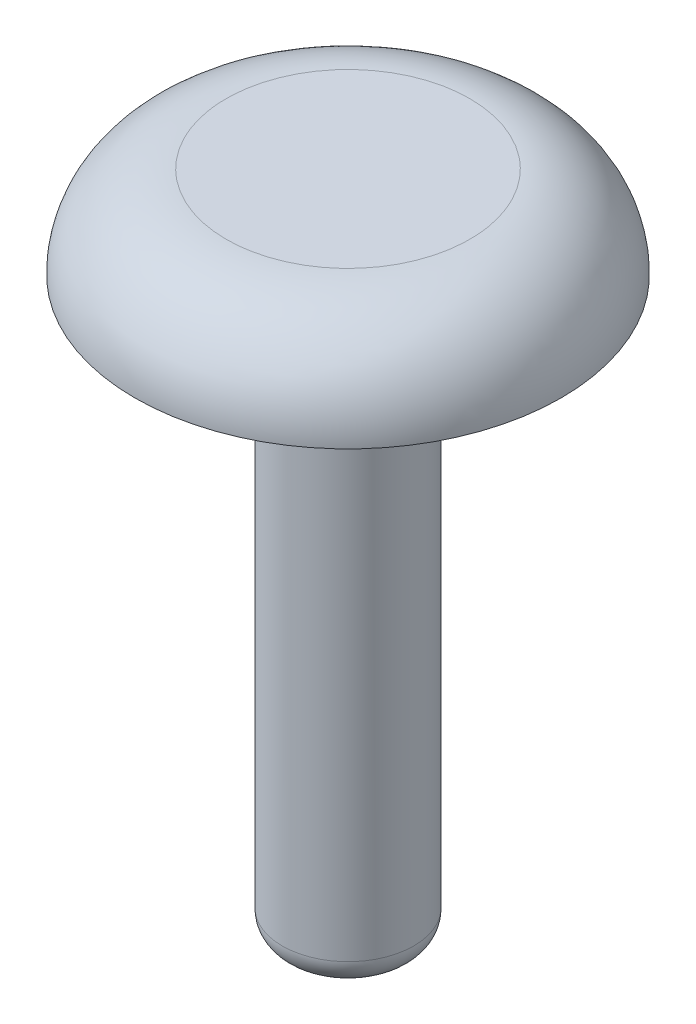
ISO-10303-21;
HEADER;
FILE_DESCRIPTION(('STEP AP214'),'2;1');
FILE_NAME('part.step','',(''),(''),'','','');
FILE_SCHEMA(('AUTOMOTIVE_DESIGN { 1 0 10303 214 1 1 1 1 }'));
ENDSEC;
DATA;
#1=APPLICATION_CONTEXT('core data for automotive mechanical design processes');
#2=APPLICATION_PROTOCOL_DEFINITION('international standard','automotive_design',2000,#1);
#3=PRODUCT_CONTEXT('',#1,'mechanical');
#4=PRODUCT('Part','Part','',(#3));
#5=PRODUCT_RELATED_PRODUCT_CATEGORY('part','',(#4));
#6=PRODUCT_DEFINITION_FORMATION('','',#4);
#7=PRODUCT_DEFINITION_CONTEXT('part definition',#1,'design');
#8=PRODUCT_DEFINITION('design','',#6,#7);
#9=PRODUCT_DEFINITION_SHAPE('','',#8);
#10=(LENGTH_UNIT() NAMED_UNIT(*) SI_UNIT(.MILLI.,.METRE.));
#11=(NAMED_UNIT(*) PLANE_ANGLE_UNIT() SI_UNIT($,.RADIAN.));
#12=(NAMED_UNIT(*) SI_UNIT($,.STERADIAN.) SOLID_ANGLE_UNIT());
#13=UNCERTAINTY_MEASURE_WITH_UNIT(LENGTH_MEASURE(1.E-05),#10,'distance_accuracy_value','');
#14=(GEOMETRIC_REPRESENTATION_CONTEXT(3) GLOBAL_UNCERTAINTY_ASSIGNED_CONTEXT((#13)) GLOBAL_UNIT_ASSIGNED_CONTEXT((#10,
#11,#12)) REPRESENTATION_CONTEXT('',''));
#15=CARTESIAN_POINT('',(0.,0.,0.));
#16=DIRECTION('',(0.,0.,1.));
#17=DIRECTION('',(1.,0.,0.));
#18=AXIS2_PLACEMENT_3D('',#15,#16,#17);
#19=CARTESIAN_POINT('',(-1.12895331786144,1.70000000000003,0.));
#20=DIRECTION('',(0.,1.,0.));
#21=DIRECTION('',(0.,0.,1.));
#22=AXIS2_PLACEMENT_3D('',#19,#20,#21);
#23=PLANE('',#22);
#24=CARTESIAN_POINT('',(0.,1.70000000000003,2.25790663572288));
#25=CARTESIAN_POINT('',(-0.0345944417074065,1.70000000000003,2.25790723830574));
#26=CARTESIAN_POINT('',(-0.0691888354077026,1.70000000000003,2.25711160204306));
#27=CARTESIAN_POINT('',(-0.138304572993575,1.70000000000003,2.25393217828492));
#28=CARTESIAN_POINT('',(-0.172825916879151,1.70000000000003,2.25154839078945));
#29=CARTESIAN_POINT('',(-0.241722601035083,1.70000000000003,2.24519699102403));
#30=CARTESIAN_POINT('',(-0.276097941305438,1.70000000000003,2.24122937875407));
#31=CARTESIAN_POINT('',(-0.344630014186162,1.70000000000003,2.23171890038318));
#32=CARTESIAN_POINT('',(-0.378786746796529,1.70000000000003,2.22617603428224));
#33=CARTESIAN_POINT('',(-0.446809451015982,1.70000000000003,2.21352670584837));
#34=CARTESIAN_POINT('',(-0.480675422625067,1.70000000000003,2.20642024351544));
#35=CARTESIAN_POINT('',(-0.548045068635516,1.70000000000003,2.1906587475224));
#36=CARTESIAN_POINT('',(-0.581548743036879,1.70000000000003,2.18200371386229));
#37=CARTESIAN_POINT('',(-0.648123023014524,1.70000000000003,2.16316335431147));
#38=CARTESIAN_POINT('',(-0.681193628590805,1.70000000000003,2.15297802842076));
#39=CARTESIAN_POINT('',(-0.746831913987679,1.70000000000003,2.13109859931469));
#40=CARTESIAN_POINT('',(-0.779399593808271,1.70000000000003,2.11940449609933));
#41=CARTESIAN_POINT('',(-0.843963234254863,1.70000000000003,2.09453221807052));
#42=CARTESIAN_POINT('',(-0.875959194880862,1.70000000000004,2.08135404325706));
#43=CARTESIAN_POINT('',(-0.939311806733374,1.70000000000002,2.05354144432956));
#44=CARTESIAN_POINT('',(-0.970668457959886,1.69999999999998,2.03890702021551));
#45=CARTESIAN_POINT('',(-1.03267622786847,1.70000000000008,2.00821289057648));
#46=CARTESIAN_POINT('',(-1.06332734655055,1.70000000000022,1.9921531850515));
#47=CARTESIAN_POINT('',(-1.12385925653853,1.69999999999984,1.95864221155326));
#48=CARTESIAN_POINT('',(-1.15374004784444,1.69999999999933,1.94119094358));
#49=CARTESIAN_POINT('',(-1.21266836691226,1.70000000000073,1.90493447261932));
#50=CARTESIAN_POINT('',(-1.24171589467418,1.70000000000264,1.88612926963189));
#51=CARTESIAN_POINT('',(-1.29891564680158,1.69999999999742,1.84720179967126));
#52=CARTESIAN_POINT('',(-1.32706787116706,1.69999999999028,1.82707953269805));
#53=CARTESIAN_POINT('',(-1.37356412712841,1.70000000000666,1.79221214318223));
#54=CARTESIAN_POINT('',(-1.39216410852251,1.70000000002111,1.77780674866815));
#55=CARTESIAN_POINT('',(-1.42891192834887,1.69999999987319,1.74842936572794));
#56=CARTESIAN_POINT('',(-1.4470597617613,1.69999999971083,1.73345737101595));
#57=CARTESIAN_POINT('',(-1.48288469436497,1.69999999859713,1.70295959238686));
#58=CARTESIAN_POINT('',(-1.50056178267736,1.69999999764578,1.68743379569083));
#59=CARTESIAN_POINT('',(-1.53542885431097,1.69999999378802,1.65584380966571));
#60=CARTESIAN_POINT('',(-1.55261882052197,1.69999999088156,1.639779601468));
#61=CARTESIAN_POINT('',(-1.59496431370679,1.69999997983591,1.59896316851181));
#62=CARTESIAN_POINT('',(-1.61980496783891,1.69999996980696,1.57388311680096));
#63=CARTESIAN_POINT('',(-1.66830559466222,1.69999993341846,1.52260015393194));
#64=CARTESIAN_POINT('',(-1.69196545190144,1.69999990705733,1.49639713343964));
#65=CARTESIAN_POINT('',(-1.7226665131159,1.69999986171165,1.46075091782226));
#66=CARTESIAN_POINT('',(-1.73026695081503,1.69999984953357,1.45178562150157));
#67=CARTESIAN_POINT('',(-1.74532073395057,1.69999982771945,1.43373178678576));
#68=CARTESIAN_POINT('',(-1.75277407496623,1.69999981808348,1.4246432447005));
#69=CARTESIAN_POINT('',(-1.77491273572648,1.69999979298965,1.39719842732472));
#70=CARTESIAN_POINT('',(-1.78937676720597,1.69999978134574,1.37866287498459));
#71=CARTESIAN_POINT('',(-1.81769709736541,1.69999977212144,1.34113344415272));
#72=CARTESIAN_POINT('',(-1.8315533907647,1.69999977454117,1.32213956168075));
#73=CARTESIAN_POINT('',(-1.85864421125324,1.69999979261982,1.28371400600913));
#74=CARTESIAN_POINT('',(-1.87187875420654,1.69999980827841,1.26428234399822));
#75=CARTESIAN_POINT('',(-1.8977105890352,1.69999984841979,1.22500175042022));
#76=CARTESIAN_POINT('',(-1.91030791893674,1.69999987290205,1.20515284385281));
#77=CARTESIAN_POINT('',(-1.93485564325837,1.69999992254533,1.16506130777584));
#78=CARTESIAN_POINT('',(-1.94680609835838,1.69999994770628,1.14481871543884));
#79=CARTESIAN_POINT('',(-1.97003301856126,1.69999998625968,1.10395412939772));
#80=CARTESIAN_POINT('',(-1.98130956987114,1.69999999965363,1.08333218466435));
#81=CARTESIAN_POINT('',(-2.00437941501385,1.70000000038271,1.03957945311998));
#82=CARTESIAN_POINT('',(-2.01610315560318,1.69999998484199,1.0164120909842));
#83=CARTESIAN_POINT('',(-2.03883863097991,1.69999996528629,0.969732320627679));
#84=CARTESIAN_POINT('',(-2.04985042419616,1.69999996127035,0.946219940917003));
#85=CARTESIAN_POINT('',(-2.06844478535254,1.69999997111093,0.904771009221577));
#86=CARTESIAN_POINT('',(-2.07619648717312,1.69999998075083,0.886909831661434));
#87=CARTESIAN_POINT('',(-2.09134451360013,1.69999999410436,0.851033139700912));
#88=CARTESIAN_POINT('',(-2.09874080449656,1.69999999781743,0.833017610850829));
#89=CARTESIAN_POINT('',(-2.11002125176066,1.69999999956469,0.804027635713947));
#90=CARTESIAN_POINT('',(-2.11412104549851,1.69999999928282,0.793137022373607));
#91=CARTESIAN_POINT('',(-2.13012985035399,1.699999998692,0.749655098008602));
#92=CARTESIAN_POINT('',(-2.14141337742254,1.69999999943645,0.716829864176932));
#93=CARTESIAN_POINT('',(-2.15807607588678,1.69999999988675,0.664376498001134));
#94=CARTESIAN_POINT('',(-2.16396615686088,1.69999999989492,0.644909017817556));
#95=CARTESIAN_POINT('',(-2.1762415216558,1.69999999994391,0.602277101358538));
#96=CARTESIAN_POINT('',(-2.18252278063238,1.69999999999037,0.579082706919839));
#97=CARTESIAN_POINT('',(-2.19829773004697,1.70000000001616,0.516914261978212));
#98=CARTESIAN_POINT('',(-2.20712781371227,1.69999999992973,0.477768867557914));
#99=CARTESIAN_POINT('',(-2.21880246610589,1.69999999982049,0.418746475235502));
#100=CARTESIAN_POINT('',(-2.22243238862839,1.69999999978748,0.39902080838883));
#101=CARTESIAN_POINT('',(-2.22916641319575,1.6999999997322,0.359479434733386));
#102=CARTESIAN_POINT('',(-2.23227051640762,1.69999999970993,0.339663728124549));
#103=CARTESIAN_POINT('',(-2.23889728324894,1.69999999968029,0.293338976238643));
#104=CARTESIAN_POINT('',(-2.24221461902071,1.69999999968037,0.266800356553573));
#105=CARTESIAN_POINT('',(-2.2479062323769,1.69999999971408,0.213622381180891));
#106=CARTESIAN_POINT('',(-2.25028050884502,1.69999999974771,0.186983025374075));
#107=CARTESIAN_POINT('',(-2.25408299574836,1.69999999983178,0.133636776981282));
#108=CARTESIAN_POINT('',(-2.25551120282397,1.69999999988222,0.10692988415581));
#109=CARTESIAN_POINT('',(-2.25742004442182,1.69999999996643,0.0534819036626336));
#110=CARTESIAN_POINT('',(-2.2579006733358,1.70000000000021,0.0267408157934825));
#111=CARTESIAN_POINT('',(-2.25791134298486,1.69999999999989,-0.0211116829197574));
#112=CARTESIAN_POINT('',(-2.25762019109285,1.69999999997859,-0.0422231962550326));
#113=CARTESIAN_POINT('',(-2.25644562155866,1.69999999989757,-0.0844294050410459));
#114=CARTESIAN_POINT('',(-2.2555622001887,1.69999999983785,-0.105524100385094));
#115=CARTESIAN_POINT('',(-2.25202456385614,1.69999999960782,-0.168758316043121));
#116=CARTESIAN_POINT('',(-2.24848297740581,1.69999999938666,-0.210851747332528));
#117=CARTESIAN_POINT('',(-2.2390445808654,1.69999999884144,-0.294771650993341));
#118=CARTESIAN_POINT('',(-2.23314774442228,1.69999999851739,-0.336598120372372));
#119=CARTESIAN_POINT('',(-2.21901733398925,1.69999999779655,-0.419855591003171));
#120=CARTESIAN_POINT('',(-2.21078373603247,1.69999999739977,-0.461286588194296));
#121=CARTESIAN_POINT('',(-2.19200569202143,1.69999999656097,-0.543621771710986));
#122=CARTESIAN_POINT('',(-2.1814612244209,1.69999999611897,-0.584525953120816));
#123=CARTESIAN_POINT('',(-2.15809460207404,1.69999999521464,-0.665678912052985));
#124=CARTESIAN_POINT('',(-2.14527242821463,1.69999999475232,-0.705927684072444));
#125=CARTESIAN_POINT('',(-2.11739073489288,1.69999999382965,-0.785643001313076));
#126=CARTESIAN_POINT('',(-2.10233119874224,1.69999999336929,-0.825109540697153));
#127=CARTESIAN_POINT('',(-2.07002217228772,1.69999999247021,-0.903136110902495));
#128=CARTESIAN_POINT('',(-2.05277266769102,1.69999999203148,-0.941696135805449));
#129=CARTESIAN_POINT('',(-2.01613799736041,1.69999999119269,-1.01778822887133));
#130=CARTESIAN_POINT('',(-1.99675281967933,1.69999999079262,-1.05532029128226));
#131=CARTESIAN_POINT('',(-1.95590782641789,1.69999999004557,-1.12923825437605));
#132=CARTESIAN_POINT('',(-1.93444800116607,1.69999998969859,-1.16562414971474));
#133=CARTESIAN_POINT('',(-1.88952127397328,1.69999998906949,-1.23713518245326));
#134=CARTESIAN_POINT('',(-1.86605436454712,1.69999998878738,-1.27226031515052));
#135=CARTESIAN_POINT('',(-1.81718735522223,1.69999998829721,-1.34113919843341));
#136=CARTESIAN_POINT('',(-1.79178724991627,1.69999998808915,-1.37489294518278));
#137=CARTESIAN_POINT('',(-1.7391338271569,1.69999998775363,-1.44092275274251));
#138=CARTESIAN_POINT('',(-1.71188050624778,1.69999998762618,-1.4731988107972));
#139=CARTESIAN_POINT('',(-1.65560647059065,1.6999999874558,-1.53617159281601));
#140=CARTESIAN_POINT('',(-1.62658575419478,1.69999998741287,-1.56686831530756));
#141=CARTESIAN_POINT('',(-1.56686831530764,1.69999998741287,-1.62658575419486));
#142=CARTESIAN_POINT('',(-1.53617159281638,1.6999999874558,-1.65560647059062));
#143=CARTESIAN_POINT('',(-1.47319881079683,1.69999998762618,-1.71188050624781));
#144=CARTESIAN_POINT('',(-1.44092275274112,1.69999998775363,-1.73913382715709));
#145=CARTESIAN_POINT('',(-1.37489294518417,1.69999998808915,-1.79178724991608));
#146=CARTESIAN_POINT('',(-1.34113919843858,1.69999998829721,-1.8171873552215));
#147=CARTESIAN_POINT('',(-1.27226031514535,1.69999998878738,-1.86605436454785));
#148=CARTESIAN_POINT('',(-1.23713518243394,1.69999998906949,-1.88952127397602));
#149=CARTESIAN_POINT('',(-1.16562414973406,1.69999998969859,-1.93444800116333));
#150=CARTESIAN_POINT('',(-1.12923825444815,1.69999999004557,-1.95590782640766));
#151=CARTESIAN_POINT('',(-1.05532029121016,1.69999999079262,-1.99675281968956));
#152=CARTESIAN_POINT('',(-1.01778822860226,1.69999999119269,-2.01613799739859));
#153=CARTESIAN_POINT('',(-0.941696136074519,1.69999999203148,-2.05277266765284));
#154=CARTESIAN_POINT('',(-0.903136111906671,1.69999999247021,-2.07002217214524));
#155=CARTESIAN_POINT('',(-0.825109539692984,1.69999999336929,-2.10233119888473));
#156=CARTESIAN_POINT('',(-0.785642997565477,1.69999999382965,-2.11739073542462));
#157=CARTESIAN_POINT('',(-0.705927687820015,1.69999999475232,-2.14527242768289));
#158=CARTESIAN_POINT('',(-0.66567892603906,1.69999999521464,-2.15809460008957));
#159=CARTESIAN_POINT('',(-0.584525939134859,1.69999999611897,-2.18146122640535));
#160=CARTESIAN_POINT('',(-0.543621719514901,1.69999999656097,-2.19200569942748));
#161=CARTESIAN_POINT('',(-0.461286640389895,1.69999999739977,-2.2107837286265));
#162=CARTESIAN_POINT('',(-0.419855785798895,1.69999999779656,-2.21901730634991));
#163=CARTESIAN_POINT('',(-0.336597925578646,1.69999999851738,-2.23314777206135));
#164=CARTESIAN_POINT('',(-0.294770924016962,1.69999999884141,-2.23904468401526));
#165=CARTESIAN_POINT('',(-0.210852474300774,1.69999999938669,-2.2484828742571));
#166=CARTESIAN_POINT('',(-0.168761029110466,1.69999999960795,-2.25202417890205));
#167=CARTESIAN_POINT('',(-0.0844463400292574,1.69999999991439,-2.2567416280398));
#168=CARTESIAN_POINT('',(-0.0422230977421811,1.69999999999956,-2.25791780120212));
#169=CARTESIAN_POINT('',(0.,1.70000000000003,-2.25790663572288));
#170=B_SPLINE_CURVE_WITH_KNOTS('',3,(#24,#25,#26,#27,#28,#29,#30,#31,#32,#33,#34,#35,#36,#37,
#38,#39,#40,#41,#42,#43,#44,#45,#46,#47,#48,#49,#50,#51,#52,#53,#54,#55,#56,#57,#58,#59,#60,#61,
#62,#63,#64,#65,#66,#67,#68,#69,#70,#71,#72,#73,#74,#75,#76,#77,#78,#79,#80,#81,#82,#83,#84,#85,
#86,#87,#88,#89,#90,#91,#92,#93,#94,#95,#96,#97,#98,#99,#100,#101,#102,#103,#104,#105,#106,#107,
#108,#109,#110,#111,#112,#113,#114,#115,#116,#117,#118,#119,#120,#121,#122,#123,#124,#125,#126,
#127,#128,#129,#130,#131,#132,#133,#134,#135,#136,#137,#138,#139,#140,#141,#142,#143,#144,#145,
#146,#147,#148,#149,#150,#151,#152,#153,#154,#155,#156,#157,#158,#159,#160,#161,#162,#163,#164,
#165,#166,#167,#168,#169),.UNSPECIFIED.,.F.,.F.,(4,2,2,2,2,2,2,2,2,2,2,2,2,2,2,2,2,2,2,2,2,2,2,
2,2,2,2,2,2,2,2,2,2,2,2,2,2,2,2,2,2,2,2,2,2,2,2,2,2,2,2,2,2,2,2,2,2,2,2,2,2,2,2,2,2,2,2,2,2,2,2,
2,4),(0.,0.103774108735635,0.20754821747127,0.311322326206906,0.415096434942541,
0.518870543678177,0.622644652413812,0.726418761149447,0.830192869885082,0.933966978620717,
1.03774108735635,1.14151519609199,1.24528930482762,1.34906341356326,1.45283752229889,
1.52340538125457,1.59397402331897,1.66454429480118,1.73511704200661,1.84097739965858,
1.94684808757074,1.98210729348658,2.01736755745018,2.08788774529313,2.15840854576941,
2.22892754591983,2.29944233281878,2.36995049359324,2.44044961544188,2.51833158566066,
2.59620715604674,2.65461625815248,2.71303088935048,2.74793957972149,2.8520291673365,
2.91303952859306,2.98511850235941,3.1054388059104,3.16560391745347,3.22576889546386,
3.30598695776809,3.38620511502668,3.46642355714838,3.54664247404191,3.609974735507,
3.67330739559286,3.79996138776333,3.92661679711289,4.0532735055433,4.17993139495631,
4.30659034725366,4.43325024433709,4.55991096810835,4.68657240046918,4.81323442332131,
4.9398969185665,5.06655976810646,5.19322285384296,5.31988605767771,5.44654926151246,
5.57321234724895,5.69987519678892,5.8265376920341,5.95319971488624,6.07986114724707,
6.20652187101832,6.33318176810176,6.45984072039911,6.58649860981211,6.71315531824253,
6.83981072759209,6.96646471976256,7.09311717665567),.UNSPECIFIED.);
#171=CARTESIAN_POINT('',(-1.81737783836882E-06,1.70000000000003,2.25790663572142));
#172=VERTEX_POINT('',#171);
#173=CARTESIAN_POINT('',(-1.8173696872263E-06,1.70000000000003,-2.25790663614445));
#174=VERTEX_POINT('',#173);
#175=EDGE_CURVE('E33',#172,#174,#170,.T.);
#176=ORIENTED_EDGE('',*,*,#175,.F.);
#177=CARTESIAN_POINT('',(0.,1.70000000000003,-2.25790663572288));
#178=CARTESIAN_POINT('',(0.0345944417074063,1.70000000000003,-2.25790723830574));
#179=CARTESIAN_POINT('',(0.0691888354077022,1.70000000000003,-2.25711160204306));
#180=CARTESIAN_POINT('',(0.138304572993574,1.70000000000003,-2.25393217828492));
#181=CARTESIAN_POINT('',(0.172825916879151,1.70000000000003,-2.25154839078945));
#182=CARTESIAN_POINT('',(0.241722601035083,1.70000000000003,-2.24519699102403));
#183=CARTESIAN_POINT('',(0.276097941305439,1.70000000000003,-2.24122937875407));
#184=CARTESIAN_POINT('',(0.344630014186162,1.70000000000003,-2.23171890038318));
#185=CARTESIAN_POINT('',(0.378786746796529,1.70000000000003,-2.22617603428224));
#186=CARTESIAN_POINT('',(0.446809451015981,1.70000000000003,-2.21352670584837));
#187=CARTESIAN_POINT('',(0.480675422625066,1.70000000000003,-2.20642024351544));
#188=CARTESIAN_POINT('',(0.548045068635515,1.70000000000003,-2.1906587475224));
#189=CARTESIAN_POINT('',(0.58154874303688,1.70000000000003,-2.18200371386229));
#190=CARTESIAN_POINT('',(0.648123023014525,1.70000000000003,-2.16316335431147));
#191=CARTESIAN_POINT('',(0.681193628590806,1.70000000000003,-2.15297802842076));
#192=CARTESIAN_POINT('',(0.746831913987679,1.70000000000003,-2.13109859931469));
#193=CARTESIAN_POINT('',(0.779399593808271,1.70000000000003,-2.11940449609933));
#194=CARTESIAN_POINT('',(0.843963234254863,1.70000000000003,-2.09453221807052));
#195=CARTESIAN_POINT('',(0.875959194880863,1.70000000000004,-2.08135404325706));
#196=CARTESIAN_POINT('',(0.939311806733375,1.70000000000002,-2.05354144432956));
#197=CARTESIAN_POINT('',(0.970668457959887,1.69999999999998,-2.03890702021551));
#198=CARTESIAN_POINT('',(1.03267622786847,1.70000000000008,-2.00821289057648));
#199=CARTESIAN_POINT('',(1.06332734655055,1.70000000000022,-1.9921531850515));
#200=CARTESIAN_POINT('',(1.12385925653853,1.69999999999984,-1.95864221155326));
#201=CARTESIAN_POINT('',(1.15374004784444,1.69999999999933,-1.94119094358));
#202=CARTESIAN_POINT('',(1.21266836691226,1.70000000000073,-1.90493447261932));
#203=CARTESIAN_POINT('',(1.24171589467419,1.70000000000264,-1.88612926963189));
#204=CARTESIAN_POINT('',(1.29891564680158,1.69999999999742,-1.84720179967126));
#205=CARTESIAN_POINT('',(1.32706787116706,1.69999999999028,-1.82707953269805));
#206=CARTESIAN_POINT('',(1.37356412712841,1.70000000000666,-1.79221214318223));
#207=CARTESIAN_POINT('',(1.39216410852252,1.70000000002111,-1.77780674866814));
#208=CARTESIAN_POINT('',(1.42891192834888,1.69999999987319,-1.74842936572793));
#209=CARTESIAN_POINT('',(1.44705976176131,1.69999999971083,-1.73345737101594));
#210=CARTESIAN_POINT('',(1.48288469436498,1.69999999859713,-1.70295959238685));
#211=CARTESIAN_POINT('',(1.50056178267738,1.69999999764578,-1.68743379569082));
#212=CARTESIAN_POINT('',(1.53542885431099,1.69999999378802,-1.65584380966569));
#213=CARTESIAN_POINT('',(1.55261882052199,1.69999999088156,-1.63977960146798));
#214=CARTESIAN_POINT('',(1.59496431370681,1.69999997983591,-1.59896316851179));
#215=CARTESIAN_POINT('',(1.61980496783894,1.69999996980696,-1.57388311680094));
#216=CARTESIAN_POINT('',(1.66830559466226,1.69999993341846,-1.52260015393191));
#217=CARTESIAN_POINT('',(1.69196545190148,1.69999990705733,-1.49639713343961));
#218=CARTESIAN_POINT('',(1.72266651311593,1.69999986171165,-1.46075091782223));
#219=CARTESIAN_POINT('',(1.73026695081507,1.69999984953357,-1.45178562150154));
#220=CARTESIAN_POINT('',(1.74532073395061,1.69999982771945,-1.43373178678573));
#221=CARTESIAN_POINT('',(1.75277407496627,1.69999981808348,-1.42464324470048));
#222=CARTESIAN_POINT('',(1.77491273572652,1.69999979298965,-1.3971984273247));
#223=CARTESIAN_POINT('',(1.789376767206,1.69999978134574,-1.37866287498457));
#224=CARTESIAN_POINT('',(1.81769709736544,1.69999977212144,-1.3411334441527));
#225=CARTESIAN_POINT('',(1.83155339076473,1.69999977454117,-1.32213956168073));
#226=CARTESIAN_POINT('',(1.85864421125326,1.69999979261982,-1.28371400600911));
#227=CARTESIAN_POINT('',(1.87187875420656,1.69999980827841,-1.26428234399821));
#228=CARTESIAN_POINT('',(1.89771058903522,1.69999984841979,-1.22500175042021));
#229=CARTESIAN_POINT('',(1.91030791893676,1.69999987290205,-1.2051528438528));
#230=CARTESIAN_POINT('',(1.93485564325838,1.69999992254533,-1.16506130777583));
#231=CARTESIAN_POINT('',(1.94680609835839,1.69999994770628,-1.14481871543883));
#232=CARTESIAN_POINT('',(1.97003301856126,1.69999998625968,-1.10395412939772));
#233=CARTESIAN_POINT('',(1.98130956987114,1.69999999965363,-1.08333218466435));
#234=CARTESIAN_POINT('',(2.00437941501385,1.70000000038271,-1.03957945311996));
#235=CARTESIAN_POINT('',(2.01610315560318,1.69999998484199,-1.01641209098418));
#236=CARTESIAN_POINT('',(2.03883863097994,1.69999996528629,-0.969732320627634));
#237=CARTESIAN_POINT('',(2.04985042419621,1.69999996127035,-0.946219940916954));
#238=CARTESIAN_POINT('',(2.06844478535255,1.69999997111093,-0.904771009221491));
#239=CARTESIAN_POINT('',(2.07619648717309,1.69999998075083,-0.886909831661324));
#240=CARTESIAN_POINT('',(2.09134451360023,1.69999999410436,-0.851033139700832));
#241=CARTESIAN_POINT('',(2.09874080449684,1.69999999781743,-0.833017610850804));
#242=CARTESIAN_POINT('',(2.11002125175077,1.69999999956469,-0.804027635738964));
#243=CARTESIAN_POINT('',(2.11412104547911,1.69999999928282,-0.793137022423925));
#244=CARTESIAN_POINT('',(2.13012985032732,1.699999998692,-0.749655098081878));
#245=CARTESIAN_POINT('',(2.14141337739825,1.69999999943645,-0.716829864247879));
#246=CARTESIAN_POINT('',(2.1580760758682,1.69999999988675,-0.664376498060704));
#247=CARTESIAN_POINT('',(2.1639661568456,1.69999999989492,-0.644909017868097));
#248=CARTESIAN_POINT('',(2.17624152164809,1.69999999994391,-0.602277101386288));
#249=CARTESIAN_POINT('',(2.18252278062875,1.69999999999037,-0.579082706933773));
#250=CARTESIAN_POINT('',(2.19829773004712,1.70000000001616,-0.516914261978244));
#251=CARTESIAN_POINT('',(2.20712781371254,1.69999999992973,-0.477768867557969));
#252=CARTESIAN_POINT('',(2.2188024661063,1.69999999982049,-0.418746475235577));
#253=CARTESIAN_POINT('',(2.22243238862883,1.69999999978748,-0.399020808388909));
#254=CARTESIAN_POINT('',(2.22916641319625,1.6999999997322,-0.359479434733466));
#255=CARTESIAN_POINT('',(2.23227051640814,1.69999999970993,-0.339663728124626));
#256=CARTESIAN_POINT('',(2.23889728324948,1.69999999968029,-0.293338976238713));
#257=CARTESIAN_POINT('',(2.24221461902125,1.69999999968037,-0.266800356553636));
#258=CARTESIAN_POINT('',(2.24790623237742,1.69999999971408,-0.213622381180939));
#259=CARTESIAN_POINT('',(2.2502805088455,1.69999999974771,-0.186983025374115));
#260=CARTESIAN_POINT('',(2.25408299574876,1.69999999983178,-0.133636776981305));
#261=CARTESIAN_POINT('',(2.25551120282431,1.69999999988222,-0.106929884155826));
#262=CARTESIAN_POINT('',(2.25742004442201,1.69999999996643,-0.0534819036626385));
#263=CARTESIAN_POINT('',(2.2579006733359,1.70000000000021,-0.0267408157934838));
#264=CARTESIAN_POINT('',(2.25791134298479,1.69999999999989,0.0211116829197568));
#265=CARTESIAN_POINT('',(2.25762019109269,1.69999999997859,0.04222319625503));
#266=CARTESIAN_POINT('',(2.25644562155834,1.69999999989757,0.0844294050410341));
#267=CARTESIAN_POINT('',(2.2555622001883,1.69999999983785,0.105524100385075));
#268=CARTESIAN_POINT('',(2.25202456385552,1.69999999960782,0.168758316043073));
#269=CARTESIAN_POINT('',(2.24848297740504,1.69999999938666,0.210851747332455));
#270=CARTESIAN_POINT('',(2.23904458086435,1.69999999884144,0.294771650993202));
#271=CARTESIAN_POINT('',(2.23314774442111,1.69999999851739,0.336598120372194));
#272=CARTESIAN_POINT('',(2.21901733398784,1.69999999779655,0.419855591002902));
#273=CARTESIAN_POINT('',(2.21078373603094,1.69999999739977,0.461286588193976));
#274=CARTESIAN_POINT('',(2.19200569201969,1.69999999656097,0.543621771710552));
#275=CARTESIAN_POINT('',(2.18146122441905,1.69999999611897,0.58452595312032));
#276=CARTESIAN_POINT('',(2.15809460207201,1.69999999521464,0.665678912052359));
#277=CARTESIAN_POINT('',(2.14527242821252,1.69999999475232,0.705927684071749));
#278=CARTESIAN_POINT('',(2.11739073489062,1.69999999382965,0.785643001312239));
#279=CARTESIAN_POINT('',(2.10233119873992,1.69999999336929,0.825109540696242));
#280=CARTESIAN_POINT('',(2.07002217228529,1.69999999247021,0.903136110901432));
#281=CARTESIAN_POINT('',(2.05277266768853,1.69999999203148,0.941696135804309));
#282=CARTESIAN_POINT('',(2.01613799735785,1.69999999119269,1.01778822887003));
#283=CARTESIAN_POINT('',(1.99675281967673,1.69999999079262,1.05532029128088));
#284=CARTESIAN_POINT('',(1.95590782641525,1.69999999004557,1.12923825437453));
#285=CARTESIAN_POINT('',(1.93444800116341,1.69999998969859,1.16562414971314));
#286=CARTESIAN_POINT('',(1.8895212739706,1.69999998906949,1.23713518245151));
#287=CARTESIAN_POINT('',(1.86605436454444,1.69999998878738,1.2722603151487));
#288=CARTESIAN_POINT('',(1.81718735521957,1.69999998829721,1.34113919843144));
#289=CARTESIAN_POINT('',(1.79178724991362,1.69999998808915,1.37489294518075));
#290=CARTESIAN_POINT('',(1.73913382715429,1.69999998775363,1.44092275274034));
#291=CARTESIAN_POINT('',(1.7118805062452,1.69999998762618,1.47319881079498));
#292=CARTESIAN_POINT('',(1.65560647058813,1.6999999874558,1.53617159281368));
#293=CARTESIAN_POINT('',(1.6265857541923,1.69999998741287,1.56686831530517));
#294=CARTESIAN_POINT('',(1.56686831530526,1.69999998741287,1.62658575419239));
#295=CARTESIAN_POINT('',(1.53617159281404,1.6999999874558,1.65560647058811));
#296=CARTESIAN_POINT('',(1.47319881079461,1.69999998762618,1.71188050624522));
#297=CARTESIAN_POINT('',(1.44092275273896,1.69999998775363,1.73913382715448));
#298=CARTESIAN_POINT('',(1.37489294518213,1.69999998808915,1.79178724991343));
#299=CARTESIAN_POINT('',(1.34113919843662,1.69999998829721,1.81718735521884));
#300=CARTESIAN_POINT('',(1.27226031514352,1.69999998878738,1.86605436454517));
#301=CARTESIAN_POINT('',(1.23713518243219,1.69999998906949,1.88952127397334));
#302=CARTESIAN_POINT('',(1.16562414973245,1.69999998969859,1.93444800116066));
#303=CARTESIAN_POINT('',(1.12923825444662,1.69999999004557,1.95590782640502));
#304=CARTESIAN_POINT('',(1.05532029120879,1.69999999079262,1.99675281968696));
#305=CARTESIAN_POINT('',(1.01778822860096,1.69999999119269,2.01613799739602));
#306=CARTESIAN_POINT('',(0.941696136073377,1.69999999203148,2.05277266765035));
#307=CARTESIAN_POINT('',(0.903136111905607,1.69999999247021,2.07002217214281));
#308=CARTESIAN_POINT('',(0.825109539692072,1.69999999336929,2.1023311988824));
#309=CARTESIAN_POINT('',(0.785642997564639,1.69999999382965,2.11739073542237));
#310=CARTESIAN_POINT('',(0.70592768781932,1.69999999475232,2.14527242768078));
#311=CARTESIAN_POINT('',(0.665678926038433,1.69999999521464,2.15809460008754));
#312=CARTESIAN_POINT('',(0.584525939134362,1.69999999611897,2.1814612264035));
#313=CARTESIAN_POINT('',(0.543621719514466,1.69999999656097,2.19200569942573));
#314=CARTESIAN_POINT('',(0.461286640389573,1.69999999739977,2.21078372862497));
#315=CARTESIAN_POINT('',(0.419855785798625,1.69999999779656,2.21901730634849));
#316=CARTESIAN_POINT('',(0.336597925578468,1.69999999851738,2.23314777206018));
#317=CARTESIAN_POINT('',(0.294770924016823,1.69999999884141,2.23904468401422));
#318=CARTESIAN_POINT('',(0.2108524743007,1.69999999938669,2.24848287425633));
#319=CARTESIAN_POINT('',(0.168761029110419,1.69999999960795,2.25202417890143));
#320=CARTESIAN_POINT('',(0.0844463400292442,1.69999999991439,2.25674162803948));
#321=CARTESIAN_POINT('',(0.0422230977421765,1.69999999999956,2.25791780120196));
#322=CARTESIAN_POINT('',(0.,1.70000000000003,2.25790663572288));
#323=B_SPLINE_CURVE_WITH_KNOTS('',3,(#177,#178,#179,#180,#181,#182,#183,#184,#185,#186,#187,
#188,#189,#190,#191,#192,#193,#194,#195,#196,#197,#198,#199,#200,#201,#202,#203,#204,#205,#206,
#207,#208,#209,#210,#211,#212,#213,#214,#215,#216,#217,#218,#219,#220,#221,#222,#223,#224,#225,
#226,#227,#228,#229,#230,#231,#232,#233,#234,#235,#236,#237,#238,#239,#240,#241,#242,#243,#244,
#245,#246,#247,#248,#249,#250,#251,#252,#253,#254,#255,#256,#257,#258,#259,#260,#261,#262,#263,
#264,#265,#266,#267,#268,#269,#270,#271,#272,#273,#274,#275,#276,#277,#278,#279,#280,#281,#282,
#283,#284,#285,#286,#287,#288,#289,#290,#291,#292,#293,#294,#295,#296,#297,#298,#299,#300,#301,
#302,#303,#304,#305,#306,#307,#308,#309,#310,#311,#312,#313,#314,#315,#316,#317,#318,#319,#320,
#321,#322),.UNSPECIFIED.,.F.,.F.,(4,2,2,2,2,2,2,2,2,2,2,2,2,2,2,2,2,2,2,2,2,2,2,2,2,2,2,2,2,2,2,
2,2,2,2,2,2,2,2,2,2,2,2,2,2,2,2,2,2,2,2,2,2,2,2,2,2,2,2,2,2,2,2,2,2,2,2,2,2,2,2,2,4),(0.,
0.103774108735634,0.20754821747127,0.311322326206906,0.415096434942541,0.518870543678175,
0.622644652413813,0.726418761149447,0.830192869885081,0.933966978620719,1.03774108735635,
1.14151519609199,1.24528930482762,1.34906341356326,1.45283752229889,1.52340538125458,
1.59397402331898,1.6645442948012,1.73511704200663,1.84097739965862,1.94684808757079,
1.98210729348663,2.01736755745022,2.08788774529317,2.15840854576944,2.22892754591985,
2.2994423328188,2.36995049359325,2.44044961544189,2.5183315856607,2.59620715604682,
2.65461625815258,2.71303088935062,2.74793957964054,2.85202916726448,2.91303952854983,
2.98511850235937,3.10543880591036,3.16560391745345,3.22576889546386,3.3059869577681,
3.38620511502671,3.46642355714842,3.54664247404196,3.60997473550704,3.6733073955929,
3.79996138776332,3.92661679711282,4.05327350554315,4.17993139495606,4.30659034725328,
4.43325024433658,4.55991096810769,4.68657240046835,4.81323442332031,4.93989691856531,
5.06655976810509,5.1932228538414,5.31988605767596,5.44654926151052,5.57321234724682,
5.6998751967866,5.8265376920316,5.95319971488356,6.07986114724423,6.20652187101534,
6.33318176809863,6.45984072039586,6.58649860980877,6.71315531823909,6.83981072758859,
6.96646471975902,7.09311717665212),.UNSPECIFIED.);
#324=EDGE_CURVE('E38',#174,#172,#323,.T.);
#325=ORIENTED_EDGE('',*,*,#324,.F.);
#326=EDGE_LOOP('',(#176,#325));
#327=FACE_BOUND('',#326,.T.);
#328=ADVANCED_FACE('F17',(#327),#23,.T.);
#329=CARTESIAN_POINT('',(0.,0.00788824899100593,0.));
#330=DIRECTION('',(0.,1.,0.));
#331=DIRECTION('',(0.,0.,1.));
#332=AXIS2_PLACEMENT_3D('',#329,#330,#331);
#333=TOROIDAL_SURFACE('',#332,2.25790663575208,1.69211175097982);
#334=ORIENTED_EDGE('',*,*,#175,.T.);
#335=ORIENTED_EDGE('',*,*,#324,.T.);
#336=EDGE_LOOP('',(#334,#335));
#337=FACE_BOUND('',#336,.T.);
#338=CARTESIAN_POINT('',(0.,0.,0.));
#339=DIRECTION('',(0.,1.,0.));
#340=DIRECTION('',(0.,0.,1.));
#341=AXIS2_PLACEMENT_3D('',#338,#339,#340);
#342=CIRCLE('',#341,3.95000000000001);
#343=CARTESIAN_POINT('',(0.,0.,3.95000000000001));
#344=VERTEX_POINT('',#343);
#345=EDGE_CURVE('E21',#344,#344,#342,.F.);
#346=ORIENTED_EDGE('',*,*,#345,.F.);
#347=EDGE_LOOP('',(#346));
#348=FACE_BOUND('',#347,.T.);
#349=ADVANCED_FACE('F36',(#337,#348),#333,.T.);
#350=CARTESIAN_POINT('',(-1.975,0.,0.));
#351=DIRECTION('',(0.,-1.,0.));
#352=DIRECTION('',(0.,0.,-1.));
#353=AXIS2_PLACEMENT_3D('',#350,#351,#352);
#354=PLANE('',#353);
#355=ORIENTED_EDGE('',*,*,#345,.T.);
#356=EDGE_LOOP('',(#355));
#357=FACE_BOUND('',#356,.T.);
#358=CARTESIAN_POINT('',(0.,0.,0.));
#359=DIRECTION('',(0.,1.,0.));
#360=DIRECTION('',(0.,0.,1.));
#361=AXIS2_PLACEMENT_3D('',#358,#359,#360);
#362=CIRCLE('',#361,3.188);
#363=CARTESIAN_POINT('',(0.,0.,3.188));
#364=VERTEX_POINT('',#363);
#365=EDGE_CURVE('E42',#364,#364,#362,.T.);
#366=ORIENTED_EDGE('',*,*,#365,.T.);
#367=EDGE_LOOP('',(#366));
#368=FACE_BOUND('',#367,.T.);
#369=ADVANCED_FACE('F58',(#357,#368),#354,.T.);
#370=CARTESIAN_POINT('',(0.,0.,0.));
#371=DIRECTION('',(0.,1.,0.));
#372=DIRECTION('',(0.,0.,1.));
#373=AXIS2_PLACEMENT_3D('',#370,#371,#372);
#374=CYLINDRICAL_SURFACE('',#373,3.188);
#375=ORIENTED_EDGE('',*,*,#365,.F.);
#376=EDGE_LOOP('',(#375));
#377=FACE_BOUND('',#376,.T.);
#378=CARTESIAN_POINT('',(0.,0.761999999999985,0.));
#379=DIRECTION('',(0.,1.,0.));
#380=DIRECTION('',(0.,0.,1.));
#381=AXIS2_PLACEMENT_3D('',#378,#379,#380);
#382=CIRCLE('',#381,3.188);
#383=CARTESIAN_POINT('',(0.,0.761999999999985,3.188));
#384=VERTEX_POINT('',#383);
#385=EDGE_CURVE('E94',#384,#384,#382,.T.);
#386=ORIENTED_EDGE('',*,*,#385,.T.);
#387=EDGE_LOOP('',(#386));
#388=FACE_BOUND('',#387,.T.);
#389=ADVANCED_FACE('F64',(#377,#388),#374,.F.);
#390=CARTESIAN_POINT('',(0.,-10.668,0.));
#391=DIRECTION('',(0.,1.,0.));
#392=DIRECTION('',(0.,0.,1.));
#393=AXIS2_PLACEMENT_3D('',#390,#391,#392);
#394=PLANE('',#393);
#395=CARTESIAN_POINT('',(0.,-10.668,0.));
#396=DIRECTION('',(0.,1.,0.));
#397=DIRECTION('',(0.,0.,1.));
#398=AXIS2_PLACEMENT_3D('',#395,#396,#397);
#399=CIRCLE('',#398,0.7112);
#400=CARTESIAN_POINT('',(0.,-10.668,0.7112));
#401=VERTEX_POINT('',#400);
#402=EDGE_CURVE('E95',#401,#401,#399,.T.);
#403=ORIENTED_EDGE('',*,*,#402,.F.);
#404=EDGE_LOOP('',(#403));
#405=FACE_BOUND('',#404,.T.);
#406=ADVANCED_FACE('F80',(#405),#394,.F.);
#407=CARTESIAN_POINT('',(0.,0.761999999999985,0.));
#408=DIRECTION('',(0.,1.,0.));
#409=DIRECTION('',(0.,0.,1.));
#410=AXIS2_PLACEMENT_3D('',#407,#408,#409);
#411=PLANE('',#410);
#412=ORIENTED_EDGE('',*,*,#385,.F.);
#413=EDGE_LOOP('',(#412));
#414=FACE_BOUND('',#413,.T.);
#415=CARTESIAN_POINT('',(0.,0.761999999999985,0.));
#416=DIRECTION('',(0.,-1.,0.));
#417=DIRECTION('',(0.,0.,-1.));
#418=AXIS2_PLACEMENT_3D('',#415,#416,#417);
#419=CIRCLE('',#418,1.2192);
#420=CARTESIAN_POINT('',(0.,0.761999999999985,-1.2192));
#421=VERTEX_POINT('',#420);
#422=EDGE_CURVE('E27',#421,#421,#419,.T.);
#423=ORIENTED_EDGE('',*,*,#422,.F.);
#424=EDGE_LOOP('',(#423));
#425=FACE_BOUND('',#424,.T.);
#426=ADVANCED_FACE('F74',(#414,#425),#411,.F.);
#427=CARTESIAN_POINT('',(0.,-10.16,0.));
#428=DIRECTION('',(0.,1.,0.));
#429=DIRECTION('',(0.,0.,1.));
#430=AXIS2_PLACEMENT_3D('',#427,#428,#429);
#431=TOROIDAL_SURFACE('',#430,0.711199999999994,0.508000000000003);
#432=CARTESIAN_POINT('',(0.,-10.16,0.));
#433=DIRECTION('',(0.,-1.,0.));
#434=DIRECTION('',(0.,0.,-1.));
#435=AXIS2_PLACEMENT_3D('',#432,#433,#434);
#436=CIRCLE('',#435,1.2192);
#437=CARTESIAN_POINT('',(0.,-10.16,-1.2192));
#438=VERTEX_POINT('',#437);
#439=EDGE_CURVE('E11',#438,#438,#436,.F.);
#440=ORIENTED_EDGE('',*,*,#439,.F.);
#441=EDGE_LOOP('',(#440));
#442=FACE_BOUND('',#441,.T.);
#443=ORIENTED_EDGE('',*,*,#402,.T.);
#444=EDGE_LOOP('',(#443));
#445=FACE_BOUND('',#444,.T.);
#446=ADVANCED_FACE('F19',(#442,#445),#431,.T.);
#447=CARTESIAN_POINT('',(0.,0.,0.));
#448=DIRECTION('',(0.,-1.,0.));
#449=DIRECTION('',(0.,0.,-1.));
#450=AXIS2_PLACEMENT_3D('',#447,#448,#449);
#451=CYLINDRICAL_SURFACE('',#450,1.2192);
#452=ORIENTED_EDGE('',*,*,#439,.T.);
#453=EDGE_LOOP('',(#452));
#454=FACE_BOUND('',#453,.T.);
#455=ORIENTED_EDGE('',*,*,#422,.T.);
#456=EDGE_LOOP('',(#455));
#457=FACE_BOUND('',#456,.T.);
#458=ADVANCED_FACE('F67',(#454,#457),#451,.T.);
#459=CLOSED_SHELL('',(#328,#349,#369,#389,#406,#426,#446,#458));
#460=MANIFOLD_SOLID_BREP('B1',#459);
#461=ADVANCED_BREP_SHAPE_REPRESENTATION('',(#18,#460),#14);
#462=SHAPE_DEFINITION_REPRESENTATION(#9,#461);
ENDSEC;
END-ISO-10303-21;
